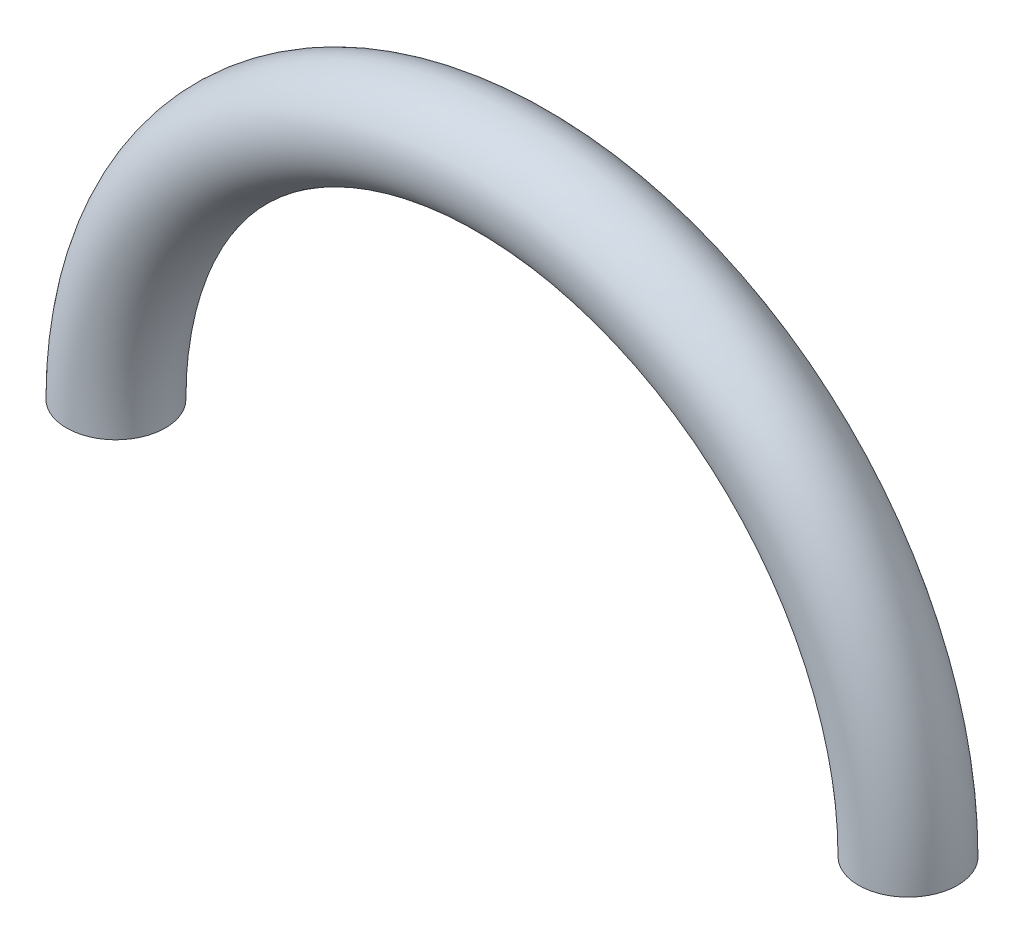
ISO-10303-21;
HEADER;
FILE_DESCRIPTION(('STEP AP214'),'2;1');
FILE_NAME('part.step','',(''),(''),'','','');
FILE_SCHEMA(('AUTOMOTIVE_DESIGN { 1 0 10303 214 1 1 1 1 }'));
ENDSEC;
DATA;
#1=APPLICATION_CONTEXT('core data for automotive mechanical design processes');
#2=APPLICATION_PROTOCOL_DEFINITION('international standard','automotive_design',2000,#1);
#3=PRODUCT_CONTEXT('',#1,'mechanical');
#4=PRODUCT('Part','Part','',(#3));
#5=PRODUCT_RELATED_PRODUCT_CATEGORY('part','',(#4));
#6=PRODUCT_DEFINITION_FORMATION('','',#4);
#7=PRODUCT_DEFINITION_CONTEXT('part definition',#1,'design');
#8=PRODUCT_DEFINITION('design','',#6,#7);
#9=PRODUCT_DEFINITION_SHAPE('','',#8);
#10=(LENGTH_UNIT() NAMED_UNIT(*) SI_UNIT(.MILLI.,.METRE.));
#11=(NAMED_UNIT(*) PLANE_ANGLE_UNIT() SI_UNIT($,.RADIAN.));
#12=(NAMED_UNIT(*) SI_UNIT($,.STERADIAN.) SOLID_ANGLE_UNIT());
#13=UNCERTAINTY_MEASURE_WITH_UNIT(LENGTH_MEASURE(1.E-05),#10,'distance_accuracy_value','');
#14=(GEOMETRIC_REPRESENTATION_CONTEXT(3) GLOBAL_UNCERTAINTY_ASSIGNED_CONTEXT((#13)) GLOBAL_UNIT_ASSIGNED_CONTEXT((#10,
#11,#12)) REPRESENTATION_CONTEXT('',''));
#15=CARTESIAN_POINT('',(0.,0.,0.));
#16=DIRECTION('',(0.,0.,1.));
#17=DIRECTION('',(1.,0.,0.));
#18=AXIS2_PLACEMENT_3D('',#15,#16,#17);
#19=CARTESIAN_POINT('',(0.,0.,0.));
#20=DIRECTION('',(0.,0.,-1.));
#21=DIRECTION('',(-1.,0.,0.));
#22=AXIS2_PLACEMENT_3D('',#19,#20,#21);
#23=TOROIDAL_SURFACE('',#22,25.4,3.175);
#24=CARTESIAN_POINT('',(-25.4,-1.77367354744357E-13,0.));
#25=DIRECTION('',(0.,-1.,0.));
#26=DIRECTION('',(0.,0.,1.));
#27=AXIS2_PLACEMENT_3D('',#24,#25,#26);
#28=CIRCLE('',#27,3.175);
#29=CARTESIAN_POINT('',(-28.575,-1.99538274087401E-13,0.));
#30=VERTEX_POINT('',#29);
#31=EDGE_CURVE('E10',#30,#30,#28,.T.);
#32=CARTESIAN_POINT('',(25.4,0.,0.));
#33=DIRECTION('',(0.,1.,0.));
#34=DIRECTION('',(0.,0.,1.));
#35=AXIS2_PLACEMENT_3D('',#32,#33,#34);
#36=CIRCLE('',#35,3.175);
#37=CARTESIAN_POINT('',(28.575,0.,0.));
#38=VERTEX_POINT('',#37);
#39=EDGE_CURVE('E36',#38,#38,#36,.T.);
#40=CARTESIAN_POINT('',(0.,0.,0.));
#41=DIRECTION('',(0.,0.,-1.));
#42=DIRECTION('',(-1.,0.,0.));
#43=AXIS2_PLACEMENT_3D('',#40,#41,#42);
#44=CIRCLE('',#43,28.575);
#45=EDGE_CURVE('',#30,#38,#44,.T.);
#46=ORIENTED_EDGE('',*,*,#31,.F.);
#47=ORIENTED_EDGE('',*,*,#39,.T.);
#48=ORIENTED_EDGE('',*,*,#45,.T.);
#49=ORIENTED_EDGE('',*,*,#45,.F.);
#50=EDGE_LOOP('',(#46,#48,#47,#49));
#51=FACE_BOUND('',#50,.T.);
#52=ADVANCED_FACE('F30',(#51),#23,.T.);
#53=CARTESIAN_POINT('',(-25.4,-1.77367354744357E-13,0.));
#54=DIRECTION('',(0.,-1.,0.));
#55=DIRECTION('',(0.,0.,1.));
#56=AXIS2_PLACEMENT_3D('',#53,#54,#55);
#57=PLANE('',#56);
#58=ORIENTED_EDGE('',*,*,#31,.T.);
#59=EDGE_LOOP('',(#58));
#60=FACE_BOUND('',#59,.T.);
#61=ADVANCED_FACE('F45',(#60),#57,.T.);
#62=CARTESIAN_POINT('',(25.4,0.,0.));
#63=DIRECTION('',(0.,1.,0.));
#64=DIRECTION('',(0.,0.,1.));
#65=AXIS2_PLACEMENT_3D('',#62,#63,#64);
#66=PLANE('',#65);
#67=ORIENTED_EDGE('',*,*,#39,.F.);
#68=EDGE_LOOP('',(#67));
#69=FACE_BOUND('',#68,.T.);
#70=ADVANCED_FACE('F43',(#69),#66,.F.);
#71=CLOSED_SHELL('',(#52,#61,#70));
#72=MANIFOLD_SOLID_BREP('B2',#71);
#73=ADVANCED_BREP_SHAPE_REPRESENTATION('',(#18,#72),#14);
#74=SHAPE_DEFINITION_REPRESENTATION(#9,#73);
ENDSEC;
END-ISO-10303-21;
